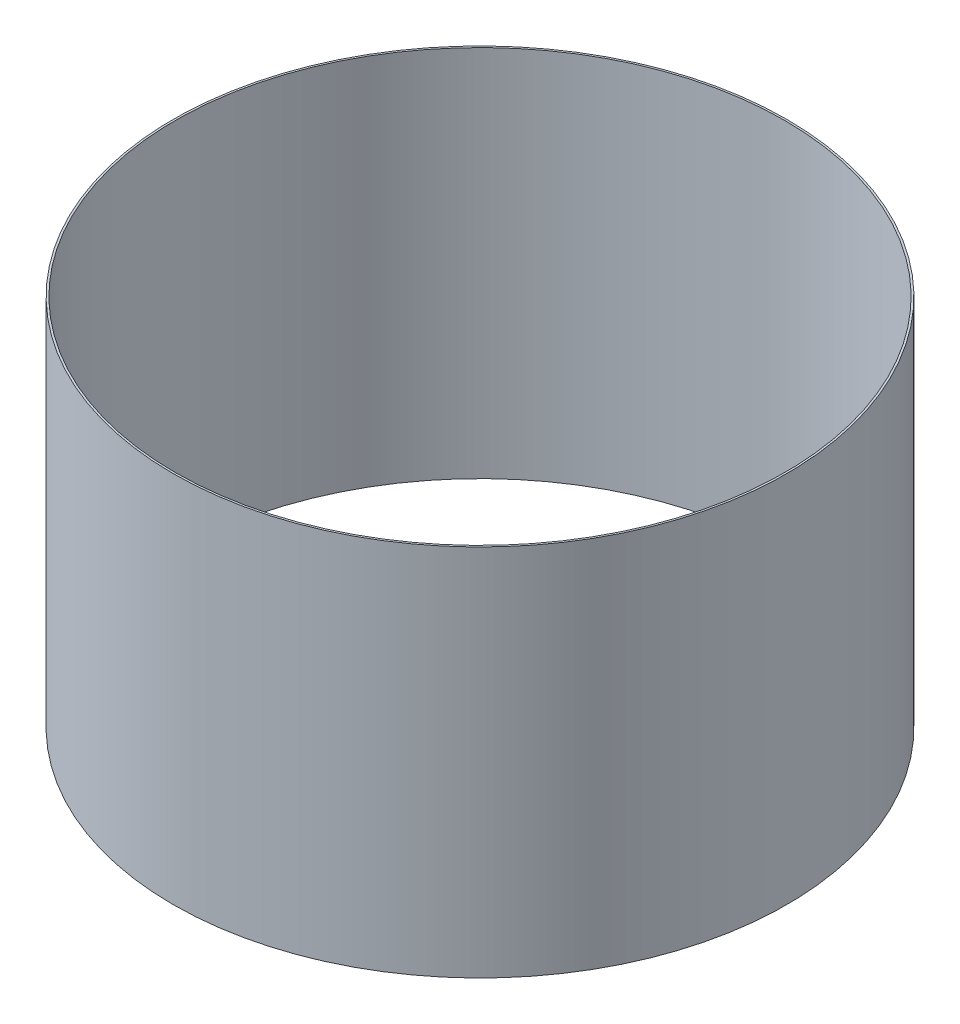
ISO-10303-21;
HEADER;
FILE_DESCRIPTION(('STEP AP214'),'2;1');
FILE_NAME('part.step','',(''),(''),'','','');
FILE_SCHEMA(('AUTOMOTIVE_DESIGN { 1 0 10303 214 1 1 1 1 }'));
ENDSEC;
DATA;
#1=APPLICATION_CONTEXT('core data for automotive mechanical design processes');
#2=APPLICATION_PROTOCOL_DEFINITION('international standard','automotive_design',2000,#1);
#3=PRODUCT_CONTEXT('',#1,'mechanical');
#4=PRODUCT('Part','Part','',(#3));
#5=PRODUCT_RELATED_PRODUCT_CATEGORY('part','',(#4));
#6=PRODUCT_DEFINITION_FORMATION('','',#4);
#7=PRODUCT_DEFINITION_CONTEXT('part definition',#1,'design');
#8=PRODUCT_DEFINITION('design','',#6,#7);
#9=PRODUCT_DEFINITION_SHAPE('','',#8);
#10=(LENGTH_UNIT() NAMED_UNIT(*) SI_UNIT(.MILLI.,.METRE.));
#11=(NAMED_UNIT(*) PLANE_ANGLE_UNIT() SI_UNIT($,.RADIAN.));
#12=(NAMED_UNIT(*) SI_UNIT($,.STERADIAN.) SOLID_ANGLE_UNIT());
#13=UNCERTAINTY_MEASURE_WITH_UNIT(LENGTH_MEASURE(1.E-05),#10,'distance_accuracy_value','');
#14=(GEOMETRIC_REPRESENTATION_CONTEXT(3) GLOBAL_UNCERTAINTY_ASSIGNED_CONTEXT((#13)) GLOBAL_UNIT_ASSIGNED_CONTEXT((#10,
#11,#12)) REPRESENTATION_CONTEXT('',''));
#15=CARTESIAN_POINT('',(0.,0.,0.));
#16=DIRECTION('',(0.,0.,1.));
#17=DIRECTION('',(1.,0.,0.));
#18=AXIS2_PLACEMENT_3D('',#15,#16,#17);
#19=CARTESIAN_POINT('',(0.,152.4,0.));
#20=DIRECTION('',(0.,-1.,0.));
#21=DIRECTION('',(0.,0.,-1.));
#22=AXIS2_PLACEMENT_3D('',#19,#20,#21);
#23=CYLINDRICAL_SURFACE('',#22,125.25375);
#24=CARTESIAN_POINT('',(0.,152.4,0.));
#25=DIRECTION('',(0.,1.,0.));
#26=DIRECTION('',(0.,0.,1.));
#27=AXIS2_PLACEMENT_3D('',#24,#25,#26);
#28=CIRCLE('',#27,125.25375);
#29=CARTESIAN_POINT('',(0.,152.4,-125.25375));
#30=VERTEX_POINT('',#29);
#31=EDGE_CURVE('E10',#30,#30,#28,.T.);
#32=CARTESIAN_POINT('',(0.,0.,0.));
#33=DIRECTION('',(0.,1.,0.));
#34=DIRECTION('',(0.,0.,1.));
#35=AXIS2_PLACEMENT_3D('',#32,#33,#34);
#36=CIRCLE('',#35,125.25375);
#37=CARTESIAN_POINT('',(0.,0.,-125.25375));
#38=VERTEX_POINT('',#37);
#39=EDGE_CURVE('E36',#38,#38,#36,.T.);
#40=CARTESIAN_POINT('',(0.,152.4,-125.25375));
#41=CARTESIAN_POINT('',(0.,150.8125,-125.25375));
#42=CARTESIAN_POINT('',(0.,149.225,-125.25375));
#43=CARTESIAN_POINT('',(0.,146.05,-125.25375));
#44=CARTESIAN_POINT('',(0.,144.4625,-125.25375));
#45=CARTESIAN_POINT('',(0.,141.2875,-125.25375));
#46=CARTESIAN_POINT('',(0.,139.7,-125.25375));
#47=CARTESIAN_POINT('',(0.,136.525,-125.25375));
#48=CARTESIAN_POINT('',(0.,134.9375,-125.25375));
#49=CARTESIAN_POINT('',(0.,131.7625,-125.25375));
#50=CARTESIAN_POINT('',(0.,130.175,-125.25375));
#51=CARTESIAN_POINT('',(0.,127.,-125.25375));
#52=CARTESIAN_POINT('',(0.,125.4125,-125.25375));
#53=CARTESIAN_POINT('',(0.,122.2375,-125.25375));
#54=CARTESIAN_POINT('',(0.,120.65,-125.25375));
#55=CARTESIAN_POINT('',(0.,117.475,-125.25375));
#56=CARTESIAN_POINT('',(0.,115.8875,-125.25375));
#57=CARTESIAN_POINT('',(0.,112.7125,-125.25375));
#58=CARTESIAN_POINT('',(0.,111.125,-125.25375));
#59=CARTESIAN_POINT('',(0.,107.95,-125.25375));
#60=CARTESIAN_POINT('',(0.,106.3625,-125.25375));
#61=CARTESIAN_POINT('',(0.,103.1875,-125.25375));
#62=CARTESIAN_POINT('',(0.,101.6,-125.25375));
#63=CARTESIAN_POINT('',(0.,98.425,-125.25375));
#64=CARTESIAN_POINT('',(0.,96.8375,-125.25375));
#65=CARTESIAN_POINT('',(0.,93.6625,-125.25375));
#66=CARTESIAN_POINT('',(0.,92.075,-125.25375));
#67=CARTESIAN_POINT('',(0.,88.9,-125.25375));
#68=CARTESIAN_POINT('',(0.,87.3125,-125.25375));
#69=CARTESIAN_POINT('',(0.,84.1375,-125.25375));
#70=CARTESIAN_POINT('',(0.,82.55,-125.25375));
#71=CARTESIAN_POINT('',(0.,79.375,-125.25375));
#72=CARTESIAN_POINT('',(0.,77.7875,-125.25375));
#73=CARTESIAN_POINT('',(0.,74.6125,-125.25375));
#74=CARTESIAN_POINT('',(0.,73.025,-125.25375));
#75=CARTESIAN_POINT('',(0.,69.85,-125.25375));
#76=CARTESIAN_POINT('',(0.,68.2625,-125.25375));
#77=CARTESIAN_POINT('',(0.,65.0875,-125.25375));
#78=CARTESIAN_POINT('',(0.,63.5,-125.25375));
#79=CARTESIAN_POINT('',(0.,60.325,-125.25375));
#80=CARTESIAN_POINT('',(0.,58.7375,-125.25375));
#81=CARTESIAN_POINT('',(0.,55.5625,-125.25375));
#82=CARTESIAN_POINT('',(0.,53.975,-125.25375));
#83=CARTESIAN_POINT('',(0.,50.8,-125.25375));
#84=CARTESIAN_POINT('',(0.,49.2125,-125.25375));
#85=CARTESIAN_POINT('',(0.,46.0375,-125.25375));
#86=CARTESIAN_POINT('',(0.,44.45,-125.25375));
#87=CARTESIAN_POINT('',(0.,41.275,-125.25375));
#88=CARTESIAN_POINT('',(0.,39.6875,-125.25375));
#89=CARTESIAN_POINT('',(0.,36.5125,-125.25375));
#90=CARTESIAN_POINT('',(0.,34.925,-125.25375));
#91=CARTESIAN_POINT('',(0.,31.75,-125.25375));
#92=CARTESIAN_POINT('',(0.,30.1625,-125.25375));
#93=CARTESIAN_POINT('',(0.,26.9875,-125.25375));
#94=CARTESIAN_POINT('',(0.,25.4,-125.25375));
#95=CARTESIAN_POINT('',(0.,22.225,-125.25375));
#96=CARTESIAN_POINT('',(0.,20.6375,-125.25375));
#97=CARTESIAN_POINT('',(0.,17.4625,-125.25375));
#98=CARTESIAN_POINT('',(0.,15.875,-125.25375));
#99=CARTESIAN_POINT('',(0.,12.7,-125.25375));
#100=CARTESIAN_POINT('',(0.,11.1125,-125.25375));
#101=CARTESIAN_POINT('',(0.,7.93750000000001,-125.25375));
#102=CARTESIAN_POINT('',(0.,6.35,-125.25375));
#103=CARTESIAN_POINT('',(0.,3.175,-125.25375));
#104=CARTESIAN_POINT('',(0.,1.5875,-125.25375));
#105=CARTESIAN_POINT('',(0.,0.,-125.25375));
#106=B_SPLINE_CURVE_WITH_KNOTS('',3,(#40,#41,#42,#43,#44,#45,#46,#47,#48,#49,#50,#51,#52,#53,
#54,#55,#56,#57,#58,#59,#60,#61,#62,#63,#64,#65,#66,#67,#68,#69,#70,#71,#72,#73,#74,#75,#76,#77,
#78,#79,#80,#81,#82,#83,#84,#85,#86,#87,#88,#89,#90,#91,#92,#93,#94,#95,#96,#97,#98,#99,#100,
#101,#102,#103,#104,#105),.UNSPECIFIED.,.F.,.F.,(4,2,2,2,2,2,2,2,2,2,2,2,2,2,2,2,2,2,2,2,2,2,2,
2,2,2,2,2,2,2,2,2,4),(0.,4.76249999999998,9.52499999999998,14.2875,19.05,23.8125,28.575,33.3375,
38.1,42.8625,47.625,52.3875,57.15,61.9125,66.675,71.4375,76.2,80.9625,85.725,90.4875,95.25,
100.0125,104.775,109.5375,114.3,119.0625,123.825,128.5875,133.35,138.1125,142.875,147.6375,
152.4),.UNSPECIFIED.);
#107=EDGE_CURVE('BSEAM33',#30,#38,#106,.T.);
#108=ORIENTED_EDGE('',*,*,#31,.F.);
#109=ORIENTED_EDGE('',*,*,#39,.T.);
#110=ORIENTED_EDGE('',*,*,#107,.T.);
#111=ORIENTED_EDGE('',*,*,#107,.F.);
#112=EDGE_LOOP('',(#108,#110,#109,#111));
#113=FACE_BOUND('',#112,.T.);
#114=ADVANCED_FACE('F33',(#113),#23,.T.);
#115=CARTESIAN_POINT('',(0.,152.4,0.));
#116=DIRECTION('',(0.,1.,0.));
#117=DIRECTION('',(0.,0.,1.));
#118=AXIS2_PLACEMENT_3D('',#115,#116,#117);
#119=PLANE('',#118);
#120=CARTESIAN_POINT('',(0.,152.4,0.));
#121=DIRECTION('',(0.,-1.,0.));
#122=DIRECTION('',(0.,0.,-1.));
#123=AXIS2_PLACEMENT_3D('',#120,#121,#122);
#124=CIRCLE('',#123,124.46);
#125=CARTESIAN_POINT('',(0.,152.4,-124.46));
#126=VERTEX_POINT('',#125);
#127=EDGE_CURVE('E43',#126,#126,#124,.T.);
#128=ORIENTED_EDGE('',*,*,#127,.T.);
#129=EDGE_LOOP('',(#128));
#130=FACE_BOUND('',#129,.T.);
#131=ORIENTED_EDGE('',*,*,#31,.T.);
#132=EDGE_LOOP('',(#131));
#133=FACE_BOUND('',#132,.T.);
#134=ADVANCED_FACE('F51',(#130,#133),#119,.T.);
#135=CARTESIAN_POINT('',(0.,0.,0.));
#136=DIRECTION('',(0.,1.,0.));
#137=DIRECTION('',(0.,0.,1.));
#138=AXIS2_PLACEMENT_3D('',#135,#136,#137);
#139=PLANE('',#138);
#140=CARTESIAN_POINT('',(0.,0.,0.));
#141=DIRECTION('',(0.,-1.,0.));
#142=DIRECTION('',(0.,0.,-1.));
#143=AXIS2_PLACEMENT_3D('',#140,#141,#142);
#144=CIRCLE('',#143,124.46);
#145=CARTESIAN_POINT('',(0.,0.,-124.46));
#146=VERTEX_POINT('',#145);
#147=EDGE_CURVE('E45',#146,#146,#144,.T.);
#148=ORIENTED_EDGE('',*,*,#147,.F.);
#149=EDGE_LOOP('',(#148));
#150=FACE_BOUND('',#149,.T.);
#151=ORIENTED_EDGE('',*,*,#39,.F.);
#152=EDGE_LOOP('',(#151));
#153=FACE_BOUND('',#152,.T.);
#154=ADVANCED_FACE('F56',(#150,#153),#139,.F.);
#155=CARTESIAN_POINT('',(0.,152.4,0.));
#156=DIRECTION('',(0.,-1.,0.));
#157=DIRECTION('',(0.,0.,-1.));
#158=AXIS2_PLACEMENT_3D('',#155,#156,#157);
#159=CYLINDRICAL_SURFACE('',#158,124.46);
#160=CARTESIAN_POINT('',(0.,152.4,-124.46));
#161=CARTESIAN_POINT('',(0.,150.8125,-124.46));
#162=CARTESIAN_POINT('',(0.,149.225,-124.46));
#163=CARTESIAN_POINT('',(0.,146.05,-124.46));
#164=CARTESIAN_POINT('',(0.,144.4625,-124.46));
#165=CARTESIAN_POINT('',(0.,141.2875,-124.46));
#166=CARTESIAN_POINT('',(0.,139.7,-124.46));
#167=CARTESIAN_POINT('',(0.,136.525,-124.46));
#168=CARTESIAN_POINT('',(0.,134.9375,-124.46));
#169=CARTESIAN_POINT('',(0.,131.7625,-124.46));
#170=CARTESIAN_POINT('',(0.,130.175,-124.46));
#171=CARTESIAN_POINT('',(0.,127.,-124.46));
#172=CARTESIAN_POINT('',(0.,125.4125,-124.46));
#173=CARTESIAN_POINT('',(0.,122.2375,-124.46));
#174=CARTESIAN_POINT('',(0.,120.65,-124.46));
#175=CARTESIAN_POINT('',(0.,117.475,-124.46));
#176=CARTESIAN_POINT('',(0.,115.8875,-124.46));
#177=CARTESIAN_POINT('',(0.,112.7125,-124.46));
#178=CARTESIAN_POINT('',(0.,111.125,-124.46));
#179=CARTESIAN_POINT('',(0.,107.95,-124.46));
#180=CARTESIAN_POINT('',(0.,106.3625,-124.46));
#181=CARTESIAN_POINT('',(0.,103.1875,-124.46));
#182=CARTESIAN_POINT('',(0.,101.6,-124.46));
#183=CARTESIAN_POINT('',(0.,98.425,-124.46));
#184=CARTESIAN_POINT('',(0.,96.8375,-124.46));
#185=CARTESIAN_POINT('',(0.,93.6625,-124.46));
#186=CARTESIAN_POINT('',(0.,92.075,-124.46));
#187=CARTESIAN_POINT('',(0.,88.9,-124.46));
#188=CARTESIAN_POINT('',(0.,87.3125,-124.46));
#189=CARTESIAN_POINT('',(0.,84.1375,-124.46));
#190=CARTESIAN_POINT('',(0.,82.55,-124.46));
#191=CARTESIAN_POINT('',(0.,79.375,-124.46));
#192=CARTESIAN_POINT('',(0.,77.7875,-124.46));
#193=CARTESIAN_POINT('',(0.,74.6125,-124.46));
#194=CARTESIAN_POINT('',(0.,73.025,-124.46));
#195=CARTESIAN_POINT('',(0.,69.85,-124.46));
#196=CARTESIAN_POINT('',(0.,68.2625,-124.46));
#197=CARTESIAN_POINT('',(0.,65.0875,-124.46));
#198=CARTESIAN_POINT('',(0.,63.5,-124.46));
#199=CARTESIAN_POINT('',(0.,60.325,-124.46));
#200=CARTESIAN_POINT('',(0.,58.7375,-124.46));
#201=CARTESIAN_POINT('',(0.,55.5625,-124.46));
#202=CARTESIAN_POINT('',(0.,53.975,-124.46));
#203=CARTESIAN_POINT('',(0.,50.8,-124.46));
#204=CARTESIAN_POINT('',(0.,49.2125,-124.46));
#205=CARTESIAN_POINT('',(0.,46.0375,-124.46));
#206=CARTESIAN_POINT('',(0.,44.45,-124.46));
#207=CARTESIAN_POINT('',(0.,41.275,-124.46));
#208=CARTESIAN_POINT('',(0.,39.6875,-124.46));
#209=CARTESIAN_POINT('',(0.,36.5125,-124.46));
#210=CARTESIAN_POINT('',(0.,34.925,-124.46));
#211=CARTESIAN_POINT('',(0.,31.75,-124.46));
#212=CARTESIAN_POINT('',(0.,30.1625,-124.46));
#213=CARTESIAN_POINT('',(0.,26.9875,-124.46));
#214=CARTESIAN_POINT('',(0.,25.4,-124.46));
#215=CARTESIAN_POINT('',(0.,22.225,-124.46));
#216=CARTESIAN_POINT('',(0.,20.6375,-124.46));
#217=CARTESIAN_POINT('',(0.,17.4625,-124.46));
#218=CARTESIAN_POINT('',(0.,15.875,-124.46));
#219=CARTESIAN_POINT('',(0.,12.7,-124.46));
#220=CARTESIAN_POINT('',(0.,11.1125,-124.46));
#221=CARTESIAN_POINT('',(0.,7.93750000000001,-124.46));
#222=CARTESIAN_POINT('',(0.,6.35,-124.46));
#223=CARTESIAN_POINT('',(0.,3.175,-124.46));
#224=CARTESIAN_POINT('',(0.,1.5875,-124.46));
#225=CARTESIAN_POINT('',(0.,0.,-124.46));
#226=B_SPLINE_CURVE_WITH_KNOTS('',3,(#160,#161,#162,#163,#164,#165,#166,#167,#168,#169,#170,
#171,#172,#173,#174,#175,#176,#177,#178,#179,#180,#181,#182,#183,#184,#185,#186,#187,#188,#189,
#190,#191,#192,#193,#194,#195,#196,#197,#198,#199,#200,#201,#202,#203,#204,#205,#206,#207,#208,
#209,#210,#211,#212,#213,#214,#215,#216,#217,#218,#219,#220,#221,#222,#223,#224,#225),
.UNSPECIFIED.,.F.,.F.,(4,2,2,2,2,2,2,2,2,2,2,2,2,2,2,2,2,2,2,2,2,2,2,2,2,2,2,2,2,2,2,2,4),(0.,
4.7625,9.52500000000001,14.2875,19.05,23.8125,28.575,33.3375,38.1,42.8625,47.625,52.3875,57.15,
61.9125,66.675,71.4375,76.2,80.9625,85.725,90.4875,95.25,100.0125,104.775,109.5375,114.3,
119.0625,123.825,128.5875,133.35,138.1125,142.875,147.6375,152.4),.UNSPECIFIED.);
#227=EDGE_CURVE('BSEAM53',#126,#146,#226,.T.);
#228=ORIENTED_EDGE('',*,*,#127,.F.);
#229=ORIENTED_EDGE('',*,*,#147,.T.);
#230=ORIENTED_EDGE('',*,*,#227,.T.);
#231=ORIENTED_EDGE('',*,*,#227,.F.);
#232=EDGE_LOOP('',(#228,#230,#229,#231));
#233=FACE_BOUND('',#232,.T.);
#234=ADVANCED_FACE('F53',(#233),#159,.F.);
#235=CLOSED_SHELL('',(#114,#134,#154,#234));
#236=MANIFOLD_SOLID_BREP('B2',#235);
#237=ADVANCED_BREP_SHAPE_REPRESENTATION('',(#18,#236),#14);
#238=SHAPE_DEFINITION_REPRESENTATION(#9,#237);
ENDSEC;
END-ISO-10303-21;
